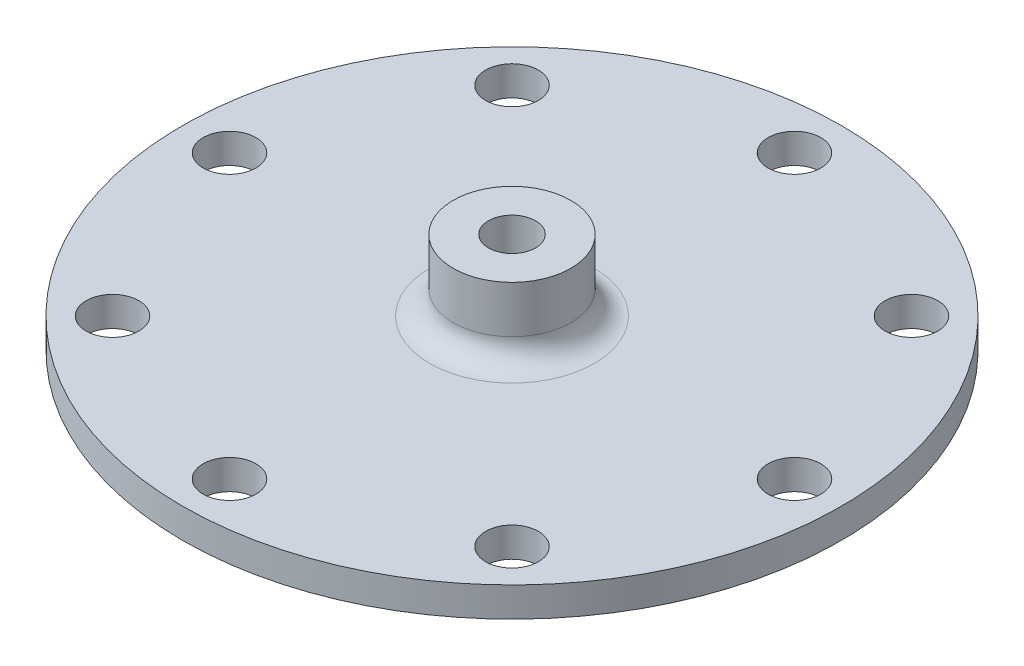
ISO-10303-21;
HEADER;
FILE_DESCRIPTION(('STEP AP214'),'2;1');
FILE_NAME('part.step','',(''),(''),'','','');
FILE_SCHEMA(('AUTOMOTIVE_DESIGN { 1 0 10303 214 1 1 1 1 }'));
ENDSEC;
DATA;
#1=APPLICATION_CONTEXT('core data for automotive mechanical design processes');
#2=APPLICATION_PROTOCOL_DEFINITION('international standard','automotive_design',2000,#1);
#3=PRODUCT_CONTEXT('',#1,'mechanical');
#4=PRODUCT('Part','Part','',(#3));
#5=PRODUCT_RELATED_PRODUCT_CATEGORY('part','',(#4));
#6=PRODUCT_DEFINITION_FORMATION('','',#4);
#7=PRODUCT_DEFINITION_CONTEXT('part definition',#1,'design');
#8=PRODUCT_DEFINITION('design','',#6,#7);
#9=PRODUCT_DEFINITION_SHAPE('','',#8);
#10=(LENGTH_UNIT() NAMED_UNIT(*) SI_UNIT(.MILLI.,.METRE.));
#11=(NAMED_UNIT(*) PLANE_ANGLE_UNIT() SI_UNIT($,.RADIAN.));
#12=(NAMED_UNIT(*) SI_UNIT($,.STERADIAN.) SOLID_ANGLE_UNIT());
#13=UNCERTAINTY_MEASURE_WITH_UNIT(LENGTH_MEASURE(1.E-05),#10,'distance_accuracy_value','');
#14=(GEOMETRIC_REPRESENTATION_CONTEXT(3) GLOBAL_UNCERTAINTY_ASSIGNED_CONTEXT((#13)) GLOBAL_UNIT_ASSIGNED_CONTEXT((#10,
#11,#12)) REPRESENTATION_CONTEXT('',''));
#15=CARTESIAN_POINT('',(0.,0.,0.));
#16=DIRECTION('',(0.,0.,1.));
#17=DIRECTION('',(1.,0.,0.));
#18=AXIS2_PLACEMENT_3D('',#15,#16,#17);
#19=CARTESIAN_POINT('',(0.,2.,0.));
#20=DIRECTION('',(0.,-1.,0.));
#21=DIRECTION('',(0.,0.,-1.));
#22=AXIS2_PLACEMENT_3D('',#19,#20,#21);
#23=CYLINDRICAL_SURFACE('',#22,22.225);
#24=CARTESIAN_POINT('',(0.,2.,0.));
#25=DIRECTION('',(0.,1.,0.));
#26=DIRECTION('',(0.,0.,1.));
#27=AXIS2_PLACEMENT_3D('',#24,#25,#26);
#28=CIRCLE('',#27,22.225);
#29=CARTESIAN_POINT('',(0.,2.,22.225));
#30=VERTEX_POINT('',#29);
#31=EDGE_CURVE('E42',#30,#30,#28,.T.);
#32=ORIENTED_EDGE('',*,*,#31,.F.);
#33=EDGE_LOOP('',(#32));
#34=FACE_BOUND('',#33,.T.);
#35=CARTESIAN_POINT('',(0.,0.,0.));
#36=DIRECTION('',(0.,1.,0.));
#37=DIRECTION('',(0.,0.,1.));
#38=AXIS2_PLACEMENT_3D('',#35,#36,#37);
#39=CIRCLE('',#38,22.225);
#40=CARTESIAN_POINT('',(0.,0.,22.225));
#41=VERTEX_POINT('',#40);
#42=EDGE_CURVE('E45',#41,#41,#39,.T.);
#43=ORIENTED_EDGE('',*,*,#42,.T.);
#44=EDGE_LOOP('',(#43));
#45=FACE_BOUND('',#44,.T.);
#46=ADVANCED_FACE('F30',(#34,#45),#23,.T.);
#47=CARTESIAN_POINT('',(0.,2.,0.));
#48=DIRECTION('',(0.,1.,0.));
#49=DIRECTION('',(0.,0.,1.));
#50=AXIS2_PLACEMENT_3D('',#47,#48,#49);
#51=PLANE('',#50);
#52=CARTESIAN_POINT('',(0.,2.,0.));
#53=DIRECTION('',(0.,1.,0.));
#54=DIRECTION('',(0.,0.,1.));
#55=AXIS2_PLACEMENT_3D('',#52,#53,#54);
#56=CIRCLE('',#55,5.55625);
#57=CARTESIAN_POINT('',(0.,2.,5.55625));
#58=VERTEX_POINT('',#57);
#59=EDGE_CURVE('E10',#58,#58,#56,.F.);
#60=ORIENTED_EDGE('',*,*,#59,.T.);
#61=EDGE_LOOP('',(#60));
#62=FACE_BOUND('',#61,.T.);
#63=CARTESIAN_POINT('',(-13.4703841816035,2.,-13.4703841816032));
#64=DIRECTION('',(0.,1.,0.));
#65=DIRECTION('',(0.,0.,1.));
#66=AXIS2_PLACEMENT_3D('',#63,#64,#65);
#67=CIRCLE('',#66,1.77800000000062);
#68=CARTESIAN_POINT('',(-13.4703841816035,2.,-11.6923841816025));
#69=VERTEX_POINT('',#68);
#70=EDGE_CURVE('E93',#69,#69,#67,.T.);
#71=ORIENTED_EDGE('',*,*,#70,.F.);
#72=EDGE_LOOP('',(#71));
#73=FACE_BOUND('',#72,.T.);
#74=CARTESIAN_POINT('',(-19.0499999999992,2.,8.12150346973795E-13));
#75=DIRECTION('',(0.,1.,0.));
#76=DIRECTION('',(0.,0.,1.));
#77=AXIS2_PLACEMENT_3D('',#74,#75,#76);
#78=CIRCLE('',#77,1.7780000000012);
#79=CARTESIAN_POINT('',(-19.0499999999992,2.,1.77800000000202));
#80=VERTEX_POINT('',#79);
#81=EDGE_CURVE('E87',#80,#80,#78,.T.);
#82=ORIENTED_EDGE('',*,*,#81,.F.);
#83=EDGE_LOOP('',(#82));
#84=FACE_BOUND('',#83,.T.);
#85=CARTESIAN_POINT('',(-13.4703841816024,2.,13.4703841816043));
#86=DIRECTION('',(0.,1.,0.));
#87=DIRECTION('',(0.,0.,1.));
#88=AXIS2_PLACEMENT_3D('',#85,#86,#87);
#89=CIRCLE('',#88,1.77800000000165);
#90=CARTESIAN_POINT('',(-13.4703841816024,2.,15.248384181606));
#91=VERTEX_POINT('',#90);
#92=EDGE_CURVE('E81',#91,#91,#89,.T.);
#93=ORIENTED_EDGE('',*,*,#92,.F.);
#94=EDGE_LOOP('',(#93));
#95=FACE_BOUND('',#94,.T.);
#96=CARTESIAN_POINT('',(1.61963478964284E-12,2.,19.05));
#97=DIRECTION('',(0.,1.,0.));
#98=DIRECTION('',(0.,0.,1.));
#99=AXIS2_PLACEMENT_3D('',#96,#97,#98);
#100=CIRCLE('',#99,1.77800000000168);
#101=CARTESIAN_POINT('',(1.61963478964284E-12,2.,20.8280000000017));
#102=VERTEX_POINT('',#101);
#103=EDGE_CURVE('E75',#102,#102,#100,.T.);
#104=ORIENTED_EDGE('',*,*,#103,.F.);
#105=EDGE_LOOP('',(#104));
#106=FACE_BOUND('',#105,.T.);
#107=CARTESIAN_POINT('',(13.4703841816051,2.,13.4703841816032));
#108=DIRECTION('',(0.,1.,0.));
#109=DIRECTION('',(0.,0.,1.));
#110=AXIS2_PLACEMENT_3D('',#107,#108,#109);
#111=CIRCLE('',#110,1.77800000000125);
#112=CARTESIAN_POINT('',(13.4703841816051,2.,15.2483841816044));
#113=VERTEX_POINT('',#112);
#114=EDGE_CURVE('E69',#113,#113,#111,.T.);
#115=ORIENTED_EDGE('',*,*,#114,.F.);
#116=EDGE_LOOP('',(#115));
#117=FACE_BOUND('',#116,.T.);
#118=CARTESIAN_POINT('',(19.0500000000008,2.,-8.09817394821419E-13));
#119=DIRECTION('',(0.,1.,0.));
#120=DIRECTION('',(0.,0.,1.));
#121=AXIS2_PLACEMENT_3D('',#118,#119,#120);
#122=CIRCLE('',#121,1.7780000000006);
#123=CARTESIAN_POINT('',(19.0500000000008,2.,1.77799999999979));
#124=VERTEX_POINT('',#123);
#125=EDGE_CURVE('E63',#124,#124,#122,.T.);
#126=ORIENTED_EDGE('',*,*,#125,.F.);
#127=EDGE_LOOP('',(#126));
#128=FACE_BOUND('',#127,.T.);
#129=CARTESIAN_POINT('',(13.470384181604,2.,-13.4703841816043));
#130=DIRECTION('',(0.,1.,0.));
#131=DIRECTION('',(0.,0.,1.));
#132=AXIS2_PLACEMENT_3D('',#129,#130,#131);
#133=CIRCLE('',#132,1.77800000000009);
#134=CARTESIAN_POINT('',(13.470384181604,2.,-11.6923841816042));
#135=VERTEX_POINT('',#134);
#136=EDGE_CURVE('E57',#135,#135,#133,.T.);
#137=ORIENTED_EDGE('',*,*,#136,.F.);
#138=EDGE_LOOP('',(#137));
#139=FACE_BOUND('',#138,.T.);
#140=CARTESIAN_POINT('',(0.,2.,-19.05));
#141=DIRECTION('',(0.,1.,0.));
#142=DIRECTION('',(0.,0.,1.));
#143=AXIS2_PLACEMENT_3D('',#140,#141,#142);
#144=CIRCLE('',#143,1.778);
#145=CARTESIAN_POINT('',(0.,2.,-17.272));
#146=VERTEX_POINT('',#145);
#147=EDGE_CURVE('E51',#146,#146,#144,.T.);
#148=ORIENTED_EDGE('',*,*,#147,.F.);
#149=EDGE_LOOP('',(#148));
#150=FACE_BOUND('',#149,.T.);
#151=ORIENTED_EDGE('',*,*,#31,.T.);
#152=EDGE_LOOP('',(#151));
#153=FACE_BOUND('',#152,.T.);
#154=ADVANCED_FACE('F146',(#62,#73,#84,#95,#106,#117,#128,#139,#150,#153),#51,.T.);
#155=CARTESIAN_POINT('',(0.,0.,0.));
#156=DIRECTION('',(0.,1.,0.));
#157=DIRECTION('',(0.,0.,1.));
#158=AXIS2_PLACEMENT_3D('',#155,#156,#157);
#159=PLANE('',#158);
#160=CARTESIAN_POINT('',(0.,0.,0.));
#161=DIRECTION('',(0.,-1.,0.));
#162=DIRECTION('',(0.,0.,-1.));
#163=AXIS2_PLACEMENT_3D('',#160,#161,#162);
#164=CIRCLE('',#163,0.79375);
#165=CARTESIAN_POINT('',(0.,0.,-0.79375));
#166=VERTEX_POINT('',#165);
#167=EDGE_CURVE('E107',#166,#166,#164,.T.);
#168=ORIENTED_EDGE('',*,*,#167,.F.);
#169=EDGE_LOOP('',(#168));
#170=FACE_BOUND('',#169,.T.);
#171=CARTESIAN_POINT('',(-13.4703841816035,0.,-13.4703841816032));
#172=DIRECTION('',(0.,1.,0.));
#173=DIRECTION('',(0.,0.,1.));
#174=AXIS2_PLACEMENT_3D('',#171,#172,#173);
#175=CIRCLE('',#174,1.77800000000062);
#176=CARTESIAN_POINT('',(-13.4703841816035,0.,-11.6923841816025));
#177=VERTEX_POINT('',#176);
#178=EDGE_CURVE('E90',#177,#177,#175,.T.);
#179=ORIENTED_EDGE('',*,*,#178,.T.);
#180=EDGE_LOOP('',(#179));
#181=FACE_BOUND('',#180,.T.);
#182=CARTESIAN_POINT('',(-19.0499999999992,0.,8.12150346973795E-13));
#183=DIRECTION('',(0.,1.,0.));
#184=DIRECTION('',(0.,0.,1.));
#185=AXIS2_PLACEMENT_3D('',#182,#183,#184);
#186=CIRCLE('',#185,1.7780000000012);
#187=CARTESIAN_POINT('',(-19.0499999999992,0.,1.77800000000202));
#188=VERTEX_POINT('',#187);
#189=EDGE_CURVE('E84',#188,#188,#186,.T.);
#190=ORIENTED_EDGE('',*,*,#189,.T.);
#191=EDGE_LOOP('',(#190));
#192=FACE_BOUND('',#191,.T.);
#193=CARTESIAN_POINT('',(-13.4703841816024,0.,13.4703841816043));
#194=DIRECTION('',(0.,1.,0.));
#195=DIRECTION('',(0.,0.,1.));
#196=AXIS2_PLACEMENT_3D('',#193,#194,#195);
#197=CIRCLE('',#196,1.77800000000165);
#198=CARTESIAN_POINT('',(-13.4703841816024,0.,15.248384181606));
#199=VERTEX_POINT('',#198);
#200=EDGE_CURVE('E78',#199,#199,#197,.T.);
#201=ORIENTED_EDGE('',*,*,#200,.T.);
#202=EDGE_LOOP('',(#201));
#203=FACE_BOUND('',#202,.T.);
#204=CARTESIAN_POINT('',(1.61963478964284E-12,0.,19.05));
#205=DIRECTION('',(0.,1.,0.));
#206=DIRECTION('',(0.,0.,1.));
#207=AXIS2_PLACEMENT_3D('',#204,#205,#206);
#208=CIRCLE('',#207,1.77800000000168);
#209=CARTESIAN_POINT('',(1.61963478964284E-12,0.,20.8280000000017));
#210=VERTEX_POINT('',#209);
#211=EDGE_CURVE('E72',#210,#210,#208,.T.);
#212=ORIENTED_EDGE('',*,*,#211,.T.);
#213=EDGE_LOOP('',(#212));
#214=FACE_BOUND('',#213,.T.);
#215=CARTESIAN_POINT('',(13.4703841816051,0.,13.4703841816032));
#216=DIRECTION('',(0.,1.,0.));
#217=DIRECTION('',(0.,0.,1.));
#218=AXIS2_PLACEMENT_3D('',#215,#216,#217);
#219=CIRCLE('',#218,1.77800000000125);
#220=CARTESIAN_POINT('',(13.4703841816051,0.,15.2483841816044));
#221=VERTEX_POINT('',#220);
#222=EDGE_CURVE('E66',#221,#221,#219,.T.);
#223=ORIENTED_EDGE('',*,*,#222,.T.);
#224=EDGE_LOOP('',(#223));
#225=FACE_BOUND('',#224,.T.);
#226=CARTESIAN_POINT('',(19.0500000000008,0.,-8.09817394821419E-13));
#227=DIRECTION('',(0.,1.,0.));
#228=DIRECTION('',(0.,0.,1.));
#229=AXIS2_PLACEMENT_3D('',#226,#227,#228);
#230=CIRCLE('',#229,1.7780000000006);
#231=CARTESIAN_POINT('',(19.0500000000008,0.,1.77799999999979));
#232=VERTEX_POINT('',#231);
#233=EDGE_CURVE('E60',#232,#232,#230,.T.);
#234=ORIENTED_EDGE('',*,*,#233,.T.);
#235=EDGE_LOOP('',(#234));
#236=FACE_BOUND('',#235,.T.);
#237=CARTESIAN_POINT('',(13.470384181604,0.,-13.4703841816043));
#238=DIRECTION('',(0.,1.,0.));
#239=DIRECTION('',(0.,0.,1.));
#240=AXIS2_PLACEMENT_3D('',#237,#238,#239);
#241=CIRCLE('',#240,1.77800000000009);
#242=CARTESIAN_POINT('',(13.470384181604,0.,-11.6923841816042));
#243=VERTEX_POINT('',#242);
#244=EDGE_CURVE('E54',#243,#243,#241,.T.);
#245=ORIENTED_EDGE('',*,*,#244,.T.);
#246=EDGE_LOOP('',(#245));
#247=FACE_BOUND('',#246,.T.);
#248=CARTESIAN_POINT('',(0.,0.,-19.05));
#249=DIRECTION('',(0.,1.,0.));
#250=DIRECTION('',(0.,0.,1.));
#251=AXIS2_PLACEMENT_3D('',#248,#249,#250);
#252=CIRCLE('',#251,1.778);
#253=CARTESIAN_POINT('',(0.,0.,-17.272));
#254=VERTEX_POINT('',#253);
#255=EDGE_CURVE('E48',#254,#254,#252,.T.);
#256=ORIENTED_EDGE('',*,*,#255,.T.);
#257=EDGE_LOOP('',(#256));
#258=FACE_BOUND('',#257,.T.);
#259=ORIENTED_EDGE('',*,*,#42,.F.);
#260=EDGE_LOOP('',(#259));
#261=FACE_BOUND('',#260,.T.);
#262=ADVANCED_FACE('F151',(#170,#181,#192,#203,#214,#225,#236,#247,#258,#261),#159,.F.);
#263=CARTESIAN_POINT('',(0.,0.,-19.05));
#264=DIRECTION('',(0.,1.,0.));
#265=DIRECTION('',(0.,0.,1.));
#266=AXIS2_PLACEMENT_3D('',#263,#264,#265);
#267=CYLINDRICAL_SURFACE('',#266,1.778);
#268=ORIENTED_EDGE('',*,*,#255,.F.);
#269=EDGE_LOOP('',(#268));
#270=FACE_BOUND('',#269,.T.);
#271=ORIENTED_EDGE('',*,*,#147,.T.);
#272=EDGE_LOOP('',(#271));
#273=FACE_BOUND('',#272,.T.);
#274=ADVANCED_FACE('F157',(#270,#273),#267,.F.);
#275=CARTESIAN_POINT('',(13.470384181604,0.,-13.4703841816043));
#276=DIRECTION('',(0.,1.,0.));
#277=DIRECTION('',(0.,0.,1.));
#278=AXIS2_PLACEMENT_3D('',#275,#276,#277);
#279=CYLINDRICAL_SURFACE('',#278,1.77800000000009);
#280=ORIENTED_EDGE('',*,*,#244,.F.);
#281=EDGE_LOOP('',(#280));
#282=FACE_BOUND('',#281,.T.);
#283=ORIENTED_EDGE('',*,*,#136,.T.);
#284=EDGE_LOOP('',(#283));
#285=FACE_BOUND('',#284,.T.);
#286=ADVANCED_FACE('F162',(#282,#285),#279,.F.);
#287=CARTESIAN_POINT('',(19.0500000000008,0.,-8.09817394821419E-13));
#288=DIRECTION('',(0.,1.,0.));
#289=DIRECTION('',(0.,0.,1.));
#290=AXIS2_PLACEMENT_3D('',#287,#288,#289);
#291=CYLINDRICAL_SURFACE('',#290,1.7780000000006);
#292=ORIENTED_EDGE('',*,*,#233,.F.);
#293=EDGE_LOOP('',(#292));
#294=FACE_BOUND('',#293,.T.);
#295=ORIENTED_EDGE('',*,*,#125,.T.);
#296=EDGE_LOOP('',(#295));
#297=FACE_BOUND('',#296,.T.);
#298=ADVANCED_FACE('F166',(#294,#297),#291,.F.);
#299=CARTESIAN_POINT('',(13.4703841816051,0.,13.4703841816032));
#300=DIRECTION('',(0.,1.,0.));
#301=DIRECTION('',(0.,0.,1.));
#302=AXIS2_PLACEMENT_3D('',#299,#300,#301);
#303=CYLINDRICAL_SURFACE('',#302,1.77800000000125);
#304=ORIENTED_EDGE('',*,*,#222,.F.);
#305=EDGE_LOOP('',(#304));
#306=FACE_BOUND('',#305,.T.);
#307=ORIENTED_EDGE('',*,*,#114,.T.);
#308=EDGE_LOOP('',(#307));
#309=FACE_BOUND('',#308,.T.);
#310=ADVANCED_FACE('F170',(#306,#309),#303,.F.);
#311=CARTESIAN_POINT('',(1.61963478964284E-12,0.,19.05));
#312=DIRECTION('',(0.,1.,0.));
#313=DIRECTION('',(0.,0.,1.));
#314=AXIS2_PLACEMENT_3D('',#311,#312,#313);
#315=CYLINDRICAL_SURFACE('',#314,1.77800000000168);
#316=ORIENTED_EDGE('',*,*,#211,.F.);
#317=EDGE_LOOP('',(#316));
#318=FACE_BOUND('',#317,.T.);
#319=ORIENTED_EDGE('',*,*,#103,.T.);
#320=EDGE_LOOP('',(#319));
#321=FACE_BOUND('',#320,.T.);
#322=ADVANCED_FACE('F174',(#318,#321),#315,.F.);
#323=CARTESIAN_POINT('',(-13.4703841816024,0.,13.4703841816043));
#324=DIRECTION('',(0.,1.,0.));
#325=DIRECTION('',(0.,0.,1.));
#326=AXIS2_PLACEMENT_3D('',#323,#324,#325);
#327=CYLINDRICAL_SURFACE('',#326,1.77800000000165);
#328=ORIENTED_EDGE('',*,*,#200,.F.);
#329=EDGE_LOOP('',(#328));
#330=FACE_BOUND('',#329,.T.);
#331=ORIENTED_EDGE('',*,*,#92,.T.);
#332=EDGE_LOOP('',(#331));
#333=FACE_BOUND('',#332,.T.);
#334=ADVANCED_FACE('F178',(#330,#333),#327,.F.);
#335=CARTESIAN_POINT('',(-19.0499999999992,0.,8.12150346973795E-13));
#336=DIRECTION('',(0.,1.,0.));
#337=DIRECTION('',(0.,0.,1.));
#338=AXIS2_PLACEMENT_3D('',#335,#336,#337);
#339=CYLINDRICAL_SURFACE('',#338,1.7780000000012);
#340=ORIENTED_EDGE('',*,*,#189,.F.);
#341=EDGE_LOOP('',(#340));
#342=FACE_BOUND('',#341,.T.);
#343=ORIENTED_EDGE('',*,*,#81,.T.);
#344=EDGE_LOOP('',(#343));
#345=FACE_BOUND('',#344,.T.);
#346=ADVANCED_FACE('F142',(#342,#345),#339,.F.);
#347=CARTESIAN_POINT('',(-13.4703841816035,0.,-13.4703841816032));
#348=DIRECTION('',(0.,1.,0.));
#349=DIRECTION('',(0.,0.,1.));
#350=AXIS2_PLACEMENT_3D('',#347,#348,#349);
#351=CYLINDRICAL_SURFACE('',#350,1.77800000000062);
#352=ORIENTED_EDGE('',*,*,#178,.F.);
#353=EDGE_LOOP('',(#352));
#354=FACE_BOUND('',#353,.T.);
#355=ORIENTED_EDGE('',*,*,#70,.T.);
#356=EDGE_LOOP('',(#355));
#357=FACE_BOUND('',#356,.T.);
#358=ADVANCED_FACE('F136',(#354,#357),#351,.F.);
#359=CARTESIAN_POINT('',(0.,6.7625,0.));
#360=DIRECTION('',(0.,-1.,0.));
#361=DIRECTION('',(0.,0.,-1.));
#362=AXIS2_PLACEMENT_3D('',#359,#360,#361);
#363=CYLINDRICAL_SURFACE('',#362,3.96875);
#364=CARTESIAN_POINT('',(0.,3.5875,0.));
#365=DIRECTION('',(0.,1.,0.));
#366=DIRECTION('',(0.,0.,1.));
#367=AXIS2_PLACEMENT_3D('',#364,#365,#366);
#368=CIRCLE('',#367,3.96875);
#369=CARTESIAN_POINT('',(0.,3.5875,-3.96875));
#370=VERTEX_POINT('',#369);
#371=EDGE_CURVE('E38',#370,#370,#368,.T.);
#372=CARTESIAN_POINT('',(0.,6.7625,0.));
#373=DIRECTION('',(0.,1.,0.));
#374=DIRECTION('',(0.,0.,1.));
#375=AXIS2_PLACEMENT_3D('',#372,#373,#374);
#376=CIRCLE('',#375,3.96875);
#377=CARTESIAN_POINT('',(0.,6.7625,-3.96875));
#378=VERTEX_POINT('',#377);
#379=EDGE_CURVE('E96',#378,#378,#376,.T.);
#380=CARTESIAN_POINT('',(0.,3.5875,-3.96875));
#381=CARTESIAN_POINT('',(0.,3.62057291666667,-3.96875));
#382=CARTESIAN_POINT('',(0.,3.65364583333333,-3.96875));
#383=CARTESIAN_POINT('',(0.,3.71979166666667,-3.96875));
#384=CARTESIAN_POINT('',(0.,3.75286458333333,-3.96875));
#385=CARTESIAN_POINT('',(0.,3.81901041666667,-3.96875));
#386=CARTESIAN_POINT('',(0.,3.85208333333333,-3.96875));
#387=CARTESIAN_POINT('',(0.,3.91822916666667,-3.96875));
#388=CARTESIAN_POINT('',(0.,3.95130208333333,-3.96875));
#389=CARTESIAN_POINT('',(0.,4.01744791666667,-3.96875));
#390=CARTESIAN_POINT('',(0.,4.05052083333333,-3.96875));
#391=CARTESIAN_POINT('',(0.,4.11666666666667,-3.96875));
#392=CARTESIAN_POINT('',(0.,4.14973958333333,-3.96875));
#393=CARTESIAN_POINT('',(0.,4.21588541666667,-3.96875));
#394=CARTESIAN_POINT('',(0.,4.24895833333333,-3.96875));
#395=CARTESIAN_POINT('',(0.,4.31510416666667,-3.96875));
#396=CARTESIAN_POINT('',(0.,4.34817708333333,-3.96875));
#397=CARTESIAN_POINT('',(0.,4.41432291666667,-3.96875));
#398=CARTESIAN_POINT('',(0.,4.44739583333333,-3.96875));
#399=CARTESIAN_POINT('',(0.,4.51354166666667,-3.96875));
#400=CARTESIAN_POINT('',(0.,4.54661458333333,-3.96875));
#401=CARTESIAN_POINT('',(0.,4.61276041666667,-3.96875));
#402=CARTESIAN_POINT('',(0.,4.64583333333333,-3.96875));
#403=CARTESIAN_POINT('',(0.,4.71197916666667,-3.96875));
#404=CARTESIAN_POINT('',(0.,4.74505208333333,-3.96875));
#405=CARTESIAN_POINT('',(0.,4.81119791666667,-3.96875));
#406=CARTESIAN_POINT('',(0.,4.84427083333333,-3.96875));
#407=CARTESIAN_POINT('',(0.,4.91041666666667,-3.96875));
#408=CARTESIAN_POINT('',(0.,4.94348958333333,-3.96875));
#409=CARTESIAN_POINT('',(0.,5.00963541666667,-3.96875));
#410=CARTESIAN_POINT('',(0.,5.04270833333333,-3.96875));
#411=CARTESIAN_POINT('',(0.,5.10885416666667,-3.96875));
#412=CARTESIAN_POINT('',(0.,5.14192708333333,-3.96875));
#413=CARTESIAN_POINT('',(0.,5.20807291666667,-3.96875));
#414=CARTESIAN_POINT('',(0.,5.24114583333333,-3.96875));
#415=CARTESIAN_POINT('',(0.,5.30729166666667,-3.96875));
#416=CARTESIAN_POINT('',(0.,5.34036458333333,-3.96875));
#417=CARTESIAN_POINT('',(0.,5.40651041666667,-3.96875));
#418=CARTESIAN_POINT('',(0.,5.43958333333333,-3.96875));
#419=CARTESIAN_POINT('',(0.,5.50572916666667,-3.96875));
#420=CARTESIAN_POINT('',(0.,5.53880208333333,-3.96875));
#421=CARTESIAN_POINT('',(0.,5.60494791666667,-3.96875));
#422=CARTESIAN_POINT('',(0.,5.63802083333333,-3.96875));
#423=CARTESIAN_POINT('',(0.,5.70416666666667,-3.96875));
#424=CARTESIAN_POINT('',(0.,5.73723958333333,-3.96875));
#425=CARTESIAN_POINT('',(0.,5.80338541666667,-3.96875));
#426=CARTESIAN_POINT('',(0.,5.83645833333333,-3.96875));
#427=CARTESIAN_POINT('',(0.,5.90260416666667,-3.96875));
#428=CARTESIAN_POINT('',(0.,5.93567708333333,-3.96875));
#429=CARTESIAN_POINT('',(0.,6.00182291666667,-3.96875));
#430=CARTESIAN_POINT('',(0.,6.03489583333333,-3.96875));
#431=CARTESIAN_POINT('',(0.,6.10104166666667,-3.96875));
#432=CARTESIAN_POINT('',(0.,6.13411458333333,-3.96875));
#433=CARTESIAN_POINT('',(0.,6.20026041666667,-3.96875));
#434=CARTESIAN_POINT('',(0.,6.23333333333333,-3.96875));
#435=CARTESIAN_POINT('',(0.,6.29947916666667,-3.96875));
#436=CARTESIAN_POINT('',(0.,6.33255208333333,-3.96875));
#437=CARTESIAN_POINT('',(0.,6.39869791666667,-3.96875));
#438=CARTESIAN_POINT('',(0.,6.43177083333333,-3.96875));
#439=CARTESIAN_POINT('',(0.,6.49791666666667,-3.96875));
#440=CARTESIAN_POINT('',(0.,6.53098958333333,-3.96875));
#441=CARTESIAN_POINT('',(0.,6.59713541666667,-3.96875));
#442=CARTESIAN_POINT('',(0.,6.63020833333333,-3.96875));
#443=CARTESIAN_POINT('',(0.,6.69635416666667,-3.96875));
#444=CARTESIAN_POINT('',(0.,6.72942708333333,-3.96875));
#445=CARTESIAN_POINT('',(0.,6.7625,-3.96875));
#446=B_SPLINE_CURVE_WITH_KNOTS('',3,(#380,#381,#382,#383,#384,#385,#386,#387,#388,#389,#390,
#391,#392,#393,#394,#395,#396,#397,#398,#399,#400,#401,#402,#403,#404,#405,#406,#407,#408,#409,
#410,#411,#412,#413,#414,#415,#416,#417,#418,#419,#420,#421,#422,#423,#424,#425,#426,#427,#428,
#429,#430,#431,#432,#433,#434,#435,#436,#437,#438,#439,#440,#441,#442,#443,#444,#445),
.UNSPECIFIED.,.F.,.F.,(4,2,2,2,2,2,2,2,2,2,2,2,2,2,2,2,2,2,2,2,2,2,2,2,2,2,2,2,2,2,2,2,4),(0.,
0.0992187499999999,0.1984375,0.29765625,0.396875,0.49609375,0.5953125,0.69453125,0.79375,
0.89296875,0.9921875,1.09140625,1.190625,1.28984375,1.3890625,1.48828125,1.5875,1.68671875,
1.7859375,1.88515625,1.984375,2.08359375,2.1828125,2.28203125,2.38125,2.48046875,2.5796875,
2.67890625,2.778125,2.87734375,2.9765625,3.07578125,3.175),.UNSPECIFIED.);
#447=EDGE_CURVE('BSEAM131',#370,#378,#446,.T.);
#448=ORIENTED_EDGE('',*,*,#371,.T.);
#449=ORIENTED_EDGE('',*,*,#379,.F.);
#450=ORIENTED_EDGE('',*,*,#447,.T.);
#451=ORIENTED_EDGE('',*,*,#447,.F.);
#452=EDGE_LOOP('',(#448,#450,#449,#451));
#453=FACE_BOUND('',#452,.T.);
#454=ADVANCED_FACE('F131',(#453),#363,.T.);
#455=CARTESIAN_POINT('',(0.,6.7625,0.));
#456=DIRECTION('',(0.,1.,0.));
#457=DIRECTION('',(0.,0.,1.));
#458=AXIS2_PLACEMENT_3D('',#455,#456,#457);
#459=PLANE('',#458);
#460=CARTESIAN_POINT('',(0.,6.7625,0.));
#461=DIRECTION('',(0.,1.,0.));
#462=DIRECTION('',(0.,0.,1.));
#463=AXIS2_PLACEMENT_3D('',#460,#461,#462);
#464=CIRCLE('',#463,1.5875);
#465=CARTESIAN_POINT('',(0.,6.7625,1.5875));
#466=VERTEX_POINT('',#465);
#467=EDGE_CURVE('E104',#466,#466,#464,.T.);
#468=ORIENTED_EDGE('',*,*,#467,.F.);
#469=EDGE_LOOP('',(#468));
#470=FACE_BOUND('',#469,.T.);
#471=ORIENTED_EDGE('',*,*,#379,.T.);
#472=EDGE_LOOP('',(#471));
#473=FACE_BOUND('',#472,.T.);
#474=ADVANCED_FACE('F125',(#470,#473),#459,.T.);
#475=CARTESIAN_POINT('',(0.,-2.49012806053458,0.));
#476=DIRECTION('',(0.,1.,0.));
#477=DIRECTION('',(0.,0.,1.));
#478=AXIS2_PLACEMENT_3D('',#475,#476,#477);
#479=CYLINDRICAL_SURFACE('',#478,1.5875);
#480=CARTESIAN_POINT('',(0.,2.,0.));
#481=DIRECTION('',(0.,1.,0.));
#482=DIRECTION('',(0.,0.,1.));
#483=AXIS2_PLACEMENT_3D('',#480,#481,#482);
#484=CIRCLE('',#483,1.5875);
#485=CARTESIAN_POINT('',(0.,2.,1.5875));
#486=VERTEX_POINT('',#485);
#487=EDGE_CURVE('E101',#486,#486,#484,.F.);
#488=ORIENTED_EDGE('',*,*,#487,.T.);
#489=EDGE_LOOP('',(#488));
#490=FACE_BOUND('',#489,.T.);
#491=ORIENTED_EDGE('',*,*,#467,.T.);
#492=EDGE_LOOP('',(#491));
#493=FACE_BOUND('',#492,.T.);
#494=ADVANCED_FACE('F119',(#490,#493),#479,.F.);
#495=CARTESIAN_POINT('',(0.,2.,0.));
#496=DIRECTION('',(0.,1.,0.));
#497=DIRECTION('',(0.,0.,1.));
#498=AXIS2_PLACEMENT_3D('',#495,#496,#497);
#499=PLANE('',#498);
#500=CARTESIAN_POINT('',(0.,2.,0.));
#501=DIRECTION('',(0.,1.,0.));
#502=DIRECTION('',(0.,0.,1.));
#503=AXIS2_PLACEMENT_3D('',#500,#501,#502);
#504=CIRCLE('',#503,0.79375);
#505=CARTESIAN_POINT('',(0.,2.,0.79375));
#506=VERTEX_POINT('',#505);
#507=EDGE_CURVE('E34',#506,#506,#504,.T.);
#508=ORIENTED_EDGE('',*,*,#507,.F.);
#509=EDGE_LOOP('',(#508));
#510=FACE_BOUND('',#509,.T.);
#511=ORIENTED_EDGE('',*,*,#487,.F.);
#512=EDGE_LOOP('',(#511));
#513=FACE_BOUND('',#512,.T.);
#514=ADVANCED_FACE('F116',(#510,#513),#499,.T.);
#515=CARTESIAN_POINT('',(0.,3.5875,0.));
#516=DIRECTION('',(0.,1.,0.));
#517=DIRECTION('',(0.,0.,1.));
#518=AXIS2_PLACEMENT_3D('',#515,#516,#517);
#519=TOROIDAL_SURFACE('',#518,5.55625,1.5875);
#520=ORIENTED_EDGE('',*,*,#59,.F.);
#521=EDGE_LOOP('',(#520));
#522=FACE_BOUND('',#521,.T.);
#523=ORIENTED_EDGE('',*,*,#371,.F.);
#524=EDGE_LOOP('',(#523));
#525=FACE_BOUND('',#524,.T.);
#526=ADVANCED_FACE('F32',(#522,#525),#519,.F.);
#527=CARTESIAN_POINT('',(0.,2.54,0.));
#528=DIRECTION('',(0.,-1.,0.));
#529=DIRECTION('',(0.,0.,-1.));
#530=AXIS2_PLACEMENT_3D('',#527,#528,#529);
#531=CYLINDRICAL_SURFACE('',#530,0.79375);
#532=ORIENTED_EDGE('',*,*,#507,.T.);
#533=EDGE_LOOP('',(#532));
#534=FACE_BOUND('',#533,.T.);
#535=ORIENTED_EDGE('',*,*,#167,.T.);
#536=EDGE_LOOP('',(#535));
#537=FACE_BOUND('',#536,.T.);
#538=ADVANCED_FACE('F114',(#534,#537),#531,.F.);
#539=CLOSED_SHELL('',(#46,#154,#262,#274,#286,#298,#310,#322,#334,#346,#358,#454,#474,#494,#514,
#526,#538));
#540=MANIFOLD_SOLID_BREP('B2',#539);
#541=ADVANCED_BREP_SHAPE_REPRESENTATION('',(#18,#540),#14);
#542=SHAPE_DEFINITION_REPRESENTATION(#9,#541);
ENDSEC;
END-ISO-10303-21;
